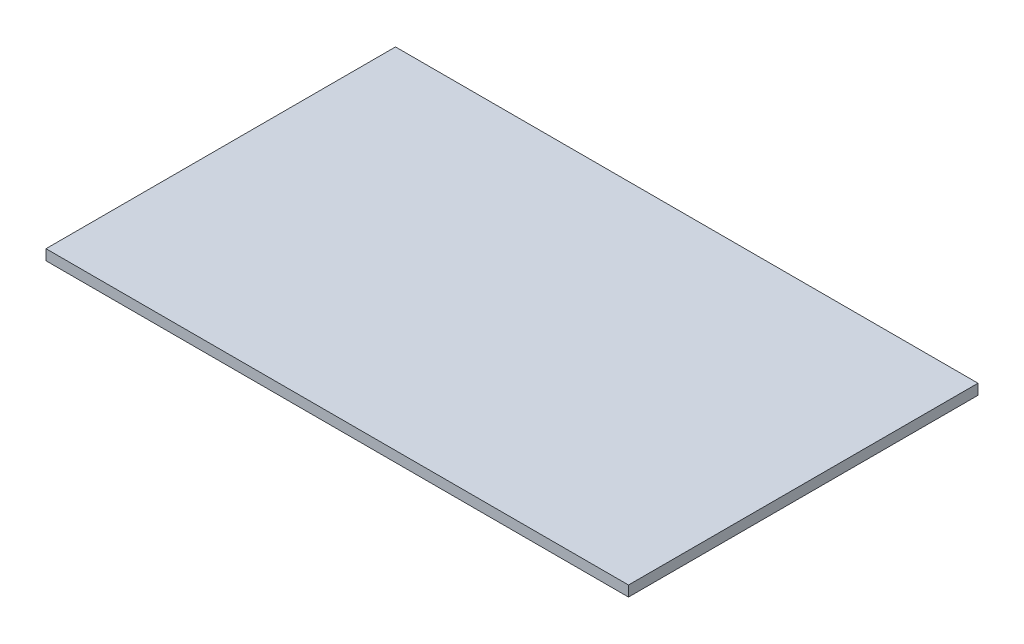
ISO-10303-21;
HEADER;
FILE_DESCRIPTION(('STEP AP214'),'2;1');
FILE_NAME('part.step','',(''),(''),'','','');
FILE_SCHEMA(('AUTOMOTIVE_DESIGN { 1 0 10303 214 1 1 1 1 }'));
ENDSEC;
DATA;
#1=APPLICATION_CONTEXT('core data for automotive mechanical design processes');
#2=APPLICATION_PROTOCOL_DEFINITION('international standard','automotive_design',2000,#1);
#3=PRODUCT_CONTEXT('',#1,'mechanical');
#4=PRODUCT('Part','Part','',(#3));
#5=PRODUCT_RELATED_PRODUCT_CATEGORY('part','',(#4));
#6=PRODUCT_DEFINITION_FORMATION('','',#4);
#7=PRODUCT_DEFINITION_CONTEXT('part definition',#1,'design');
#8=PRODUCT_DEFINITION('design','',#6,#7);
#9=PRODUCT_DEFINITION_SHAPE('','',#8);
#10=(LENGTH_UNIT() NAMED_UNIT(*) SI_UNIT(.MILLI.,.METRE.));
#11=(NAMED_UNIT(*) PLANE_ANGLE_UNIT() SI_UNIT($,.RADIAN.));
#12=(NAMED_UNIT(*) SI_UNIT($,.STERADIAN.) SOLID_ANGLE_UNIT());
#13=UNCERTAINTY_MEASURE_WITH_UNIT(LENGTH_MEASURE(1.E-05),#10,'distance_accuracy_value','');
#14=(GEOMETRIC_REPRESENTATION_CONTEXT(3) GLOBAL_UNCERTAINTY_ASSIGNED_CONTEXT((#13)) GLOBAL_UNIT_ASSIGNED_CONTEXT((#10,
#11,#12)) REPRESENTATION_CONTEXT('',''));
#15=CARTESIAN_POINT('',(0.,0.,0.));
#16=DIRECTION('',(0.,0.,1.));
#17=DIRECTION('',(1.,0.,0.));
#18=AXIS2_PLACEMENT_3D('',#15,#16,#17);
#19=CARTESIAN_POINT('',(500.,18.,300.));
#20=DIRECTION('',(-1.,0.,0.));
#21=DIRECTION('',(0.,0.,1.));
#22=AXIS2_PLACEMENT_3D('',#19,#20,#21);
#23=PLANE('',#22);
#24=DIRECTION('',(0.,0.,-1.));
#25=VECTOR('',#24,1.);
#26=CARTESIAN_POINT('',(500.,0.,300.));
#27=LINE('',#26,#25);
#28=CARTESIAN_POINT('',(500.,0.,300.));
#29=VERTEX_POINT('',#28);
#30=CARTESIAN_POINT('',(500.,0.,-300.));
#31=VERTEX_POINT('',#30);
#32=EDGE_CURVE('E111',#29,#31,#27,.T.);
#33=ORIENTED_EDGE('',*,*,#32,.T.);
#34=DIRECTION('',(0.,-1.,0.));
#35=VECTOR('',#34,1.);
#36=CARTESIAN_POINT('',(500.,18.,-300.));
#37=LINE('',#36,#35);
#38=CARTESIAN_POINT('',(500.,18.,-300.));
#39=VERTEX_POINT('',#38);
#40=EDGE_CURVE('E11',#39,#31,#37,.T.);
#41=ORIENTED_EDGE('',*,*,#40,.F.);
#42=DIRECTION('',(0.,0.,-1.));
#43=VECTOR('',#42,1.);
#44=CARTESIAN_POINT('',(500.,18.,300.));
#45=LINE('',#44,#43);
#46=CARTESIAN_POINT('',(500.,18.,300.));
#47=VERTEX_POINT('',#46);
#48=EDGE_CURVE('E95',#47,#39,#45,.T.);
#49=ORIENTED_EDGE('',*,*,#48,.F.);
#50=DIRECTION('',(0.,-1.,0.));
#51=VECTOR('',#50,1.);
#52=CARTESIAN_POINT('',(500.,18.,300.));
#53=LINE('',#52,#51);
#54=EDGE_CURVE('E107',#47,#29,#53,.T.);
#55=ORIENTED_EDGE('',*,*,#54,.T.);
#56=EDGE_LOOP('',(#33,#41,#49,#55));
#57=FACE_BOUND('',#56,.T.);
#58=ADVANCED_FACE('F43',(#57),#23,.F.);
#59=CARTESIAN_POINT('',(-500.,18.,-300.));
#60=DIRECTION('',(0.,0.,1.));
#61=DIRECTION('',(1.,0.,0.));
#62=AXIS2_PLACEMENT_3D('',#59,#60,#61);
#63=PLANE('',#62);
#64=DIRECTION('',(-1.,0.,0.));
#65=VECTOR('',#64,1.);
#66=CARTESIAN_POINT('',(-500.,0.,-300.));
#67=LINE('',#66,#65);
#68=CARTESIAN_POINT('',(-500.,0.,-300.));
#69=VERTEX_POINT('',#68);
#70=EDGE_CURVE('E100',#31,#69,#67,.T.);
#71=ORIENTED_EDGE('',*,*,#70,.T.);
#72=DIRECTION('',(0.,-1.,0.));
#73=VECTOR('',#72,1.);
#74=CARTESIAN_POINT('',(-500.,18.,-300.));
#75=LINE('',#74,#73);
#76=CARTESIAN_POINT('',(-500.,18.,-300.));
#77=VERTEX_POINT('',#76);
#78=EDGE_CURVE('E52',#77,#69,#75,.T.);
#79=ORIENTED_EDGE('',*,*,#78,.F.);
#80=DIRECTION('',(-1.,0.,0.));
#81=VECTOR('',#80,1.);
#82=CARTESIAN_POINT('',(-500.,18.,-300.));
#83=LINE('',#82,#81);
#84=EDGE_CURVE('E90',#39,#77,#83,.T.);
#85=ORIENTED_EDGE('',*,*,#84,.F.);
#86=ORIENTED_EDGE('',*,*,#40,.T.);
#87=EDGE_LOOP('',(#71,#79,#85,#86));
#88=FACE_BOUND('',#87,.T.);
#89=ADVANCED_FACE('F99',(#88),#63,.F.);
#90=CARTESIAN_POINT('',(-500.,18.,300.));
#91=DIRECTION('',(1.,0.,0.));
#92=DIRECTION('',(0.,0.,-1.));
#93=AXIS2_PLACEMENT_3D('',#90,#91,#92);
#94=PLANE('',#93);
#95=DIRECTION('',(0.,0.,1.));
#96=VECTOR('',#95,1.);
#97=CARTESIAN_POINT('',(-500.,0.,300.));
#98=LINE('',#97,#96);
#99=CARTESIAN_POINT('',(-500.,0.,300.));
#100=VERTEX_POINT('',#99);
#101=EDGE_CURVE('E77',#69,#100,#98,.T.);
#102=ORIENTED_EDGE('',*,*,#101,.T.);
#103=DIRECTION('',(0.,-1.,0.));
#104=VECTOR('',#103,1.);
#105=CARTESIAN_POINT('',(-500.,18.,300.));
#106=LINE('',#105,#104);
#107=CARTESIAN_POINT('',(-500.,18.,300.));
#108=VERTEX_POINT('',#107);
#109=EDGE_CURVE('E102',#108,#100,#106,.T.);
#110=ORIENTED_EDGE('',*,*,#109,.F.);
#111=DIRECTION('',(0.,0.,1.));
#112=VECTOR('',#111,1.);
#113=CARTESIAN_POINT('',(-500.,18.,300.));
#114=LINE('',#113,#112);
#115=EDGE_CURVE('E93',#77,#108,#114,.T.);
#116=ORIENTED_EDGE('',*,*,#115,.F.);
#117=ORIENTED_EDGE('',*,*,#78,.T.);
#118=EDGE_LOOP('',(#102,#110,#116,#117));
#119=FACE_BOUND('',#118,.T.);
#120=ADVANCED_FACE('F103',(#119),#94,.F.);
#121=CARTESIAN_POINT('',(-500.,18.,300.));
#122=DIRECTION('',(0.,0.,-1.));
#123=DIRECTION('',(-1.,0.,0.));
#124=AXIS2_PLACEMENT_3D('',#121,#122,#123);
#125=PLANE('',#124);
#126=DIRECTION('',(1.,0.,0.));
#127=VECTOR('',#126,1.);
#128=CARTESIAN_POINT('',(-500.,0.,300.));
#129=LINE('',#128,#127);
#130=EDGE_CURVE('E83',#100,#29,#129,.T.);
#131=ORIENTED_EDGE('',*,*,#130,.T.);
#132=ORIENTED_EDGE('',*,*,#54,.F.);
#133=DIRECTION('',(1.,0.,0.));
#134=VECTOR('',#133,1.);
#135=CARTESIAN_POINT('',(-500.,18.,300.));
#136=LINE('',#135,#134);
#137=EDGE_CURVE('E60',#108,#47,#136,.T.);
#138=ORIENTED_EDGE('',*,*,#137,.F.);
#139=ORIENTED_EDGE('',*,*,#109,.T.);
#140=EDGE_LOOP('',(#131,#132,#138,#139));
#141=FACE_BOUND('',#140,.T.);
#142=ADVANCED_FACE('F124',(#141),#125,.F.);
#143=CARTESIAN_POINT('',(0.,18.,0.));
#144=DIRECTION('',(0.,-1.,0.));
#145=DIRECTION('',(0.,0.,-1.));
#146=AXIS2_PLACEMENT_3D('',#143,#144,#145);
#147=PLANE('',#146);
#148=ORIENTED_EDGE('',*,*,#48,.T.);
#149=ORIENTED_EDGE('',*,*,#84,.T.);
#150=ORIENTED_EDGE('',*,*,#115,.T.);
#151=ORIENTED_EDGE('',*,*,#137,.T.);
#152=EDGE_LOOP('',(#148,#149,#150,#151));
#153=FACE_BOUND('',#152,.T.);
#154=ADVANCED_FACE('F91',(#153),#147,.F.);
#155=CARTESIAN_POINT('',(0.,0.,0.));
#156=DIRECTION('',(0.,-1.,0.));
#157=DIRECTION('',(0.,0.,-1.));
#158=AXIS2_PLACEMENT_3D('',#155,#156,#157);
#159=PLANE('',#158);
#160=ORIENTED_EDGE('',*,*,#32,.F.);
#161=ORIENTED_EDGE('',*,*,#130,.F.);
#162=ORIENTED_EDGE('',*,*,#101,.F.);
#163=ORIENTED_EDGE('',*,*,#70,.F.);
#164=EDGE_LOOP('',(#160,#161,#162,#163));
#165=FACE_BOUND('',#164,.T.);
#166=ADVANCED_FACE('F127',(#165),#159,.T.);
#167=CLOSED_SHELL('',(#58,#89,#120,#142,#154,#166));
#168=MANIFOLD_SOLID_BREP('B2',#167);
#169=ADVANCED_BREP_SHAPE_REPRESENTATION('',(#18,#168),#14);
#170=SHAPE_DEFINITION_REPRESENTATION(#9,#169);
ENDSEC;
END-ISO-10303-21;
